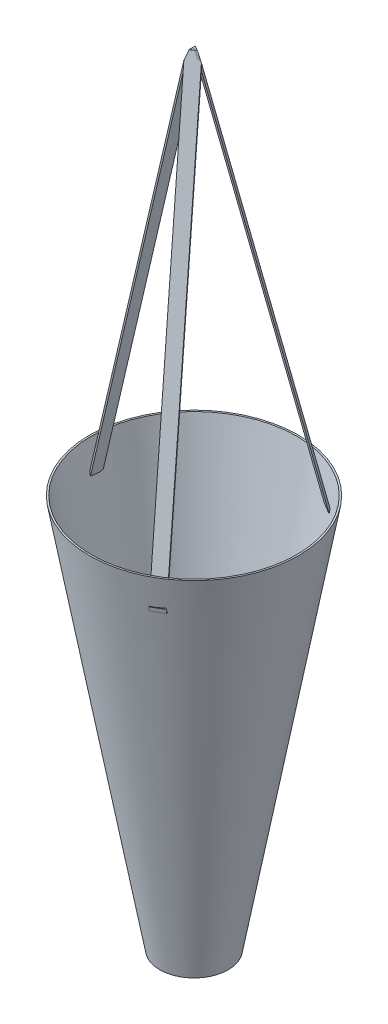
ISO-10303-21;
HEADER;
FILE_DESCRIPTION(('STEP AP214'),'2;1');
FILE_NAME('part.step','',(''),(''),'','','');
FILE_SCHEMA(('AUTOMOTIVE_DESIGN { 1 0 10303 214 1 1 1 1 }'));
ENDSEC;
DATA;
#1=APPLICATION_CONTEXT('core data for automotive mechanical design processes');
#2=APPLICATION_PROTOCOL_DEFINITION('international standard','automotive_design',2000,#1);
#3=PRODUCT_CONTEXT('',#1,'mechanical');
#4=PRODUCT('Part','Part','',(#3));
#5=PRODUCT_RELATED_PRODUCT_CATEGORY('part','',(#4));
#6=PRODUCT_DEFINITION_FORMATION('','',#4);
#7=PRODUCT_DEFINITION_CONTEXT('part definition',#1,'design');
#8=PRODUCT_DEFINITION('design','',#6,#7);
#9=PRODUCT_DEFINITION_SHAPE('','',#8);
#10=(LENGTH_UNIT() NAMED_UNIT(*) SI_UNIT(.MILLI.,.METRE.));
#11=(NAMED_UNIT(*) PLANE_ANGLE_UNIT() SI_UNIT($,.RADIAN.));
#12=(NAMED_UNIT(*) SI_UNIT($,.STERADIAN.) SOLID_ANGLE_UNIT());
#13=UNCERTAINTY_MEASURE_WITH_UNIT(LENGTH_MEASURE(1.E-05),#10,'distance_accuracy_value','');
#14=(GEOMETRIC_REPRESENTATION_CONTEXT(3) GLOBAL_UNCERTAINTY_ASSIGNED_CONTEXT((#13)) GLOBAL_UNIT_ASSIGNED_CONTEXT((#10,
#11,#12)) REPRESENTATION_CONTEXT('',''));
#15=CARTESIAN_POINT('',(0.,0.,0.));
#16=DIRECTION('',(0.,0.,1.));
#17=DIRECTION('',(1.,0.,0.));
#18=AXIS2_PLACEMENT_3D('',#15,#16,#17);
#19=CARTESIAN_POINT('',(81.7570441449587,-44.45,-122.557354335723));
#20=DIRECTION('',(0.486886500691648,0.227521739130435,-0.843312156717372));
#21=DIRECTION('',(0.113760869565216,-0.973773001383311,-0.197039606000174));
#22=AXIS2_PLACEMENT_3D('',#19,#20,#21);
#23=PLANE('',#22);
#24=DIRECTION('',(0.113760869565216,-0.973773001383311,-0.197039606000174));
#25=VECTOR('',#24,1.);
#26=CARTESIAN_POINT('',(65.2592602028651,-44.45,-132.082354335723));
#27=LINE('',#26,#25);
#28=CARTESIAN_POINT('',(-5.49926131403124,561.23047813184,-9.52499999999999));
#29=VERTEX_POINT('',#28);
#30=CARTESIAN_POINT('',(65.2592602028651,-44.45,-132.082354335723));
#31=VERTEX_POINT('',#30);
#32=EDGE_CURVE('E114',#29,#31,#27,.T.);
#33=ORIENTED_EDGE('',*,*,#32,.F.);
#34=DIRECTION('',(0.211678041190381,0.905963369850688,0.366637122188394));
#35=VECTOR('',#34,1.);
#36=CARTESIAN_POINT('',(-126.514738114892,43.2948975205752,-219.129954321261));
#37=LINE('',#36,#35);
#38=CARTESIAN_POINT('',(-2.54,573.895855878403,-4.39940905122488));
#39=VERTEX_POINT('',#38);
#40=EDGE_CURVE('E59',#29,#39,#37,.T.);
#41=ORIENTED_EDGE('',*,*,#40,.T.);
#42=DIRECTION('',(-0.866025403784443,0.,-0.499999999999992));
#43=VECTOR('',#42,1.);
#44=CARTESIAN_POINT('',(9.51889197104679,573.895855878403,2.56279547438745));
#45=LINE('',#44,#43);
#46=CARTESIAN_POINT('',(5.0800000000001,573.895855878403,0.));
#47=VERTEX_POINT('',#46);
#48=EDGE_CURVE('E133',#47,#39,#45,.T.);
#49=ORIENTED_EDGE('',*,*,#48,.F.);
#50=DIRECTION('',(-0.423356082380763,0.905963369850687,0.));
#51=VECTOR('',#50,1.);
#52=CARTESIAN_POINT('',(255.986380190965,36.9672532785679,-1.87350135405495E-12));
#53=LINE('',#52,#51);
#54=CARTESIAN_POINT('',(10.9985226280623,561.230478131841,0.));
#55=VERTEX_POINT('',#54);
#56=EDGE_CURVE('E118',#55,#47,#53,.T.);
#57=ORIENTED_EDGE('',*,*,#56,.F.);
#58=DIRECTION('',(0.113760869565216,-0.973773001383311,-0.197039606000174));
#59=VECTOR('',#58,1.);
#60=CARTESIAN_POINT('',(81.7570441449587,-44.45,-122.557354335723));
#61=LINE('',#60,#59);
#62=CARTESIAN_POINT('',(81.7570441449587,-44.45,-122.557354335723));
#63=VERTEX_POINT('',#62);
#64=EDGE_CURVE('E127',#55,#63,#61,.T.);
#65=ORIENTED_EDGE('',*,*,#64,.T.);
#66=DIRECTION('',(-0.866025403784443,0.,-0.499999999999992));
#67=VECTOR('',#66,1.);
#68=CARTESIAN_POINT('',(81.7570441449587,-44.45,-122.557354335723));
#69=LINE('',#68,#67);
#70=EDGE_CURVE('E130',#63,#31,#69,.T.);
#71=ORIENTED_EDGE('',*,*,#70,.T.);
#72=EDGE_LOOP('',(#33,#41,#49,#57,#65,#71));
#73=FACE_BOUND('',#72,.T.);
#74=ADVANCED_FACE('F45',(#73),#23,.T.);
#75=CARTESIAN_POINT('',(9.51889197104679,573.895855878403,2.56279547438745));
#76=DIRECTION('',(0.,1.,0.));
#77=DIRECTION('',(-0.866025403784443,0.,-0.499999999999992));
#78=AXIS2_PLACEMENT_3D('',#75,#76,#77);
#79=PLANE('',#78);
#80=ORIENTED_EDGE('',*,*,#48,.T.);
#81=DIRECTION('',(0.,0.,1.));
#82=VECTOR('',#81,1.);
#83=CARTESIAN_POINT('',(-2.54,573.895855878403,2.56279547438745));
#84=LINE('',#83,#82);
#85=CARTESIAN_POINT('',(-2.53999999999996,573.895855878403,-1.46646968374156));
#86=VERTEX_POINT('',#85);
#87=EDGE_CURVE('E109',#39,#86,#84,.T.);
#88=ORIENTED_EDGE('',*,*,#87,.T.);
#89=DIRECTION('',(-0.866025403784443,0.,-0.499999999999992));
#90=VECTOR('',#89,1.);
#91=CARTESIAN_POINT('',(8.24889197104681,573.895855878403,4.76249999999994));
#92=LINE('',#91,#90);
#93=CARTESIAN_POINT('',(2.54000000000008,573.895855878403,1.4664696837417));
#94=VERTEX_POINT('',#93);
#95=EDGE_CURVE('E108',#94,#86,#92,.T.);
#96=ORIENTED_EDGE('',*,*,#95,.F.);
#97=DIRECTION('',(-0.866025403784437,0.,0.500000000000002));
#98=VECTOR('',#97,1.);
#99=CARTESIAN_POINT('',(-6.97889197104672,573.895855878403,6.96220452561255));
#100=LINE('',#99,#98);
#101=EDGE_CURVE('E149',#47,#94,#100,.T.);
#102=ORIENTED_EDGE('',*,*,#101,.F.);
#103=EDGE_LOOP('',(#80,#88,#96,#102));
#104=FACE_BOUND('',#103,.T.);
#105=ADVANCED_FACE('F152',(#104),#79,.T.);
#106=CARTESIAN_POINT('',(8.24889197104681,573.895855878403,4.76249999999994));
#107=DIRECTION('',(-0.486886500691648,-0.227521739130435,0.843312156717372));
#108=DIRECTION('',(-0.113760869565216,0.973773001383311,0.197039606000174));
#109=AXIS2_PLACEMENT_3D('',#106,#107,#108);
#110=PLANE('',#109);
#111=ORIENTED_EDGE('',*,*,#95,.T.);
#112=DIRECTION('',(-0.211678041190381,-0.905963369850688,-0.366637122188394));
#113=VECTOR('',#112,1.);
#114=CARTESIAN_POINT('',(-1.57315143664399,578.03388256113,0.208161151215939));
#115=LINE('',#114,#113);
#116=CARTESIAN_POINT('',(-6.3459279806979,557.606819380276,-8.05853031625836));
#117=VERTEX_POINT('',#116);
#118=EDGE_CURVE('E96',#86,#117,#115,.T.);
#119=ORIENTED_EDGE('',*,*,#118,.T.);
#120=DIRECTION('',(-0.113760869565216,0.973773001383311,0.197039606000174));
#121=VECTOR('',#120,1.);
#122=CARTESIAN_POINT('',(-8.24889197104683,573.895855878403,-4.76249999999991));
#123=LINE('',#122,#121);
#124=CARTESIAN_POINT('',(64.7096474026701,-50.6163875143826,-131.130397041295));
#125=VERTEX_POINT('',#124);
#126=EDGE_CURVE('E105',#125,#117,#123,.T.);
#127=ORIENTED_EDGE('',*,*,#126,.F.);
#128=DIRECTION('',(-0.866025403784443,0.,-0.499999999999992));
#129=VECTOR('',#128,1.);
#130=CARTESIAN_POINT('',(81.2074313447637,-50.6163875143826,-121.605397041295));
#131=LINE('',#130,#129);
#132=CARTESIAN_POINT('',(81.2074313447637,-50.6163875143826,-121.605397041295));
#133=VERTEX_POINT('',#132);
#134=EDGE_CURVE('E129',#133,#125,#131,.T.);
#135=ORIENTED_EDGE('',*,*,#134,.F.);
#136=DIRECTION('',(-0.113760869565216,0.973773001383311,0.197039606000174));
#137=VECTOR('',#136,1.);
#138=CARTESIAN_POINT('',(8.24889197104681,573.895855878403,4.76249999999994));
#139=LINE('',#138,#137);
#140=CARTESIAN_POINT('',(10.1518559613957,557.606819380276,1.46646968374165));
#141=VERTEX_POINT('',#140);
#142=EDGE_CURVE('E124',#133,#141,#139,.T.);
#143=ORIENTED_EDGE('',*,*,#142,.T.);
#144=DIRECTION('',(0.423356082380763,-0.905963369850687,0.));
#145=VECTOR('',#144,1.);
#146=CARTESIAN_POINT('',(3.56320683446907,571.706238319121,1.4664696837417));
#147=LINE('',#146,#145);
#148=EDGE_CURVE('E67',#94,#141,#147,.T.);
#149=ORIENTED_EDGE('',*,*,#148,.F.);
#150=EDGE_LOOP('',(#111,#119,#127,#135,#143,#149));
#151=FACE_BOUND('',#150,.T.);
#152=ADVANCED_FACE('F104',(#151),#110,.T.);
#153=CARTESIAN_POINT('',(-8.24889197104682,0.,-4.76249999999992));
#154=DIRECTION('',(0.866025403784443,0.,0.499999999999992));
#155=DIRECTION('',(0.499999999999992,0.,-0.866025403784443));
#156=AXIS2_PLACEMENT_3D('',#153,#154,#155);
#157=PLANE('',#156);
#158=DIRECTION('',(-0.211678041190381,-0.905963369850685,0.366637122188405));
#159=VECTOR('',#158,1.);
#160=CARTESIAN_POINT('',(-113.620679423156,98.4803329002958,177.746789551406));
#161=LINE('',#160,#159);
#162=EDGE_CURVE('E12',#29,#117,#161,.T.);
#163=ORIENTED_EDGE('',*,*,#162,.F.);
#164=ORIENTED_EDGE('',*,*,#32,.T.);
#165=DIRECTION('',(-0.0877471696578557,-0.984480440063763,0.151982556067776));
#166=VECTOR('',#165,1.);
#167=CARTESIAN_POINT('',(64.7096474026701,-50.6163875143826,-131.130397041295));
#168=LINE('',#167,#166);
#169=EDGE_CURVE('E113',#31,#125,#168,.T.);
#170=ORIENTED_EDGE('',*,*,#169,.T.);
#171=ORIENTED_EDGE('',*,*,#126,.T.);
#172=EDGE_LOOP('',(#163,#164,#170,#171));
#173=FACE_BOUND('',#172,.T.);
#174=ADVANCED_FACE('F111',(#173),#157,.F.);
#175=CARTESIAN_POINT('',(81.2074313447637,-50.6163875143826,-121.605397041295));
#176=DIRECTION('',(0.492240220031874,-0.175494339315714,-0.852585070624107));
#177=DIRECTION('',(-0.0877471696578557,-0.984480440063763,0.151982556067776));
#178=AXIS2_PLACEMENT_3D('',#175,#176,#177);
#179=PLANE('',#178);
#180=ORIENTED_EDGE('',*,*,#134,.T.);
#181=ORIENTED_EDGE('',*,*,#169,.F.);
#182=ORIENTED_EDGE('',*,*,#70,.F.);
#183=DIRECTION('',(-0.0877471696578557,-0.984480440063763,0.151982556067776));
#184=VECTOR('',#183,1.);
#185=CARTESIAN_POINT('',(81.2074313447637,-50.6163875143826,-121.605397041295));
#186=LINE('',#185,#184);
#187=EDGE_CURVE('E116',#63,#133,#186,.T.);
#188=ORIENTED_EDGE('',*,*,#187,.T.);
#189=EDGE_LOOP('',(#180,#181,#182,#188));
#190=FACE_BOUND('',#189,.T.);
#191=ADVANCED_FACE('F47',(#190),#179,.T.);
#192=CARTESIAN_POINT('',(8.24889197104682,0.,4.76249999999992));
#193=DIRECTION('',(0.866025403784443,0.,0.499999999999992));
#194=DIRECTION('',(0.499999999999992,0.,-0.866025403784443));
#195=AXIS2_PLACEMENT_3D('',#192,#193,#194);
#196=PLANE('',#195);
#197=DIRECTION('',(0.211678041190375,0.90596336985069,-0.366637122188395));
#198=VECTOR('',#197,1.);
#199=CARTESIAN_POINT('',(-97.1228954810603,98.4803329002906,187.271789551402));
#200=LINE('',#199,#198);
#201=EDGE_CURVE('E53',#141,#55,#200,.T.);
#202=ORIENTED_EDGE('',*,*,#201,.F.);
#203=ORIENTED_EDGE('',*,*,#142,.F.);
#204=ORIENTED_EDGE('',*,*,#187,.F.);
#205=ORIENTED_EDGE('',*,*,#64,.F.);
#206=EDGE_LOOP('',(#202,#203,#204,#205));
#207=FACE_BOUND('',#206,.T.);
#208=ADVANCED_FACE('F147',(#207),#196,.T.);
#209=CARTESIAN_POINT('',(64.7788693887433,30.2711227386523,112.200293038171));
#210=DIRECTION('',(-0.486886500691658,-0.227521739130434,-0.843312156717366));
#211=DIRECTION('',(-0.866025403784437,0.,0.500000000000002));
#212=AXIS2_PLACEMENT_3D('',#209,#210,#211);
#213=PLANE('',#212);
#214=ORIENTED_EDGE('',*,*,#56,.T.);
#215=ORIENTED_EDGE('',*,*,#101,.T.);
#216=ORIENTED_EDGE('',*,*,#148,.T.);
#217=ORIENTED_EDGE('',*,*,#201,.T.);
#218=EDGE_LOOP('',(#214,#215,#216,#217));
#219=FACE_BOUND('',#218,.T.);
#220=ADVANCED_FACE('F138',(#219),#213,.F.);
#221=CARTESIAN_POINT('',(-129.557738777486,30.2711227386526,0.));
#222=DIRECTION('',(-0.973773001383311,0.227521739130435,0.));
#223=DIRECTION('',(-0.227521739130435,-0.973773001383311,0.));
#224=AXIS2_PLACEMENT_3D('',#221,#222,#223);
#225=PLANE('',#224);
#226=ORIENTED_EDGE('',*,*,#162,.T.);
#227=ORIENTED_EDGE('',*,*,#118,.F.);
#228=ORIENTED_EDGE('',*,*,#87,.F.);
#229=ORIENTED_EDGE('',*,*,#40,.F.);
#230=EDGE_LOOP('',(#226,#227,#228,#229));
#231=FACE_BOUND('',#230,.T.);
#232=ADVANCED_FACE('F95',(#231),#225,.T.);
#233=CLOSED_SHELL('',(#74,#105,#152,#174,#191,#208,#220,#232));
#234=MANIFOLD_SOLID_BREP('B2',#233);
#235=CARTESIAN_POINT('',(65.2592602028669,-44.45,132.082354335722));
#236=DIRECTION('',(0.48688650069166,0.227521739130435,0.843312156717365));
#237=DIRECTION('',(0.113760869565218,-0.973773001383311,0.197039606000172));
#238=AXIS2_PLACEMENT_3D('',#235,#236,#237);
#239=PLANE('',#238);
#240=DIRECTION('',(0.866025403784436,0.,-0.500000000000004));
#241=VECTOR('',#240,1.);
#242=CARTESIAN_POINT('',(-6.97889197104675,573.895855878403,6.9622045256125));
#243=LINE('',#242,#241);
#244=CARTESIAN_POINT('',(-2.53999999999997,573.895855878403,4.39940905122494));
#245=VERTEX_POINT('',#244);
#246=CARTESIAN_POINT('',(5.08000000000003,573.895855878403,0.));
#247=VERTEX_POINT('',#246);
#248=EDGE_CURVE('E293',#245,#247,#243,.T.);
#249=ORIENTED_EDGE('',*,*,#248,.F.);
#250=DIRECTION('',(-0.211678041190381,-0.905963369850687,0.3666371221884));
#251=VECTOR('',#250,1.);
#252=CARTESIAN_POINT('',(-127.993190095482,36.967253278568,221.690708268197));
#253=LINE('',#252,#251);
#254=CARTESIAN_POINT('',(-5.49926131403115,561.230478131841,9.52499999999999));
#255=VERTEX_POINT('',#254);
#256=EDGE_CURVE('E282',#245,#255,#253,.T.);
#257=ORIENTED_EDGE('',*,*,#256,.T.);
#258=DIRECTION('',(0.113760869565218,-0.973773001383311,0.197039606000172));
#259=VECTOR('',#258,1.);
#260=CARTESIAN_POINT('',(65.2592602028669,-44.45,132.082354335722));
#261=LINE('',#260,#259);
#262=CARTESIAN_POINT('',(65.2592602028669,-44.45,132.082354335722));
#263=VERTEX_POINT('',#262);
#264=EDGE_CURVE('E291',#255,#263,#261,.T.);
#265=ORIENTED_EDGE('',*,*,#264,.T.);
#266=DIRECTION('',(0.866025403784436,0.,-0.500000000000004));
#267=VECTOR('',#266,1.);
#268=CARTESIAN_POINT('',(65.2592602028669,-44.45,132.082354335722));
#269=LINE('',#268,#267);
#270=CARTESIAN_POINT('',(81.7570441449604,-44.45,122.557354335722));
#271=VERTEX_POINT('',#270);
#272=EDGE_CURVE('E309',#263,#271,#269,.T.);
#273=ORIENTED_EDGE('',*,*,#272,.T.);
#274=DIRECTION('',(0.113760869565218,-0.973773001383311,0.197039606000172));
#275=VECTOR('',#274,1.);
#276=CARTESIAN_POINT('',(81.7570441449604,-44.45,122.557354335722));
#277=LINE('',#276,#275);
#278=CARTESIAN_POINT('',(10.9985226280623,561.230478131841,-1.66533453693773E-13));
#279=VERTEX_POINT('',#278);
#280=EDGE_CURVE('E317',#279,#271,#277,.T.);
#281=ORIENTED_EDGE('',*,*,#280,.F.);
#282=DIRECTION('',(0.423356082380764,-0.905963369850686,0.));
#283=VECTOR('',#282,1.);
#284=CARTESIAN_POINT('',(253.029476229784,43.2948975205778,-1.9151347174784E-12));
#285=LINE('',#284,#283);
#286=EDGE_CURVE('E252',#247,#279,#285,.T.);
#287=ORIENTED_EDGE('',*,*,#286,.F.);
#288=EDGE_LOOP('',(#249,#257,#265,#273,#281,#287));
#289=FACE_BOUND('',#288,.T.);
#290=ADVANCED_FACE('F230',(#289),#239,.T.);
#291=CARTESIAN_POINT('',(-6.97889197104675,573.895855878403,6.9622045256125));
#292=DIRECTION('',(0.,1.,0.));
#293=DIRECTION('',(0.866025403784436,0.,-0.500000000000004));
#294=AXIS2_PLACEMENT_3D('',#291,#292,#293);
#295=PLANE('',#294);
#296=DIRECTION('',(0.866025403784436,0.,-0.500000000000004));
#297=VECTOR('',#296,1.);
#298=CARTESIAN_POINT('',(-8.24889197104677,573.895855878403,4.76250000000003));
#299=LINE('',#298,#297);
#300=CARTESIAN_POINT('',(-2.53999999999997,573.895855878403,1.46646968374161));
#301=VERTEX_POINT('',#300);
#302=CARTESIAN_POINT('',(2.54,573.895855878403,-1.46646968374168));
#303=VERTEX_POINT('',#302);
#304=EDGE_CURVE('E304',#301,#303,#299,.T.);
#305=ORIENTED_EDGE('',*,*,#304,.F.);
#306=DIRECTION('',(0.,0.,1.));
#307=VECTOR('',#306,1.);
#308=CARTESIAN_POINT('',(-2.53999999999997,573.895855878403,6.9622045256125));
#309=LINE('',#308,#307);
#310=EDGE_CURVE('E295',#301,#245,#309,.T.);
#311=ORIENTED_EDGE('',*,*,#310,.T.);
#312=ORIENTED_EDGE('',*,*,#248,.T.);
#313=DIRECTION('',(0.866025403784444,0.,0.499999999999991));
#314=VECTOR('',#313,1.);
#315=CARTESIAN_POINT('',(9.51889197104681,573.895855878403,2.56279547438742));
#316=LINE('',#315,#314);
#317=EDGE_CURVE('E294',#303,#247,#316,.T.);
#318=ORIENTED_EDGE('',*,*,#317,.F.);
#319=EDGE_LOOP('',(#305,#311,#312,#318));
#320=FACE_BOUND('',#319,.T.);
#321=ADVANCED_FACE('F338',(#320),#295,.T.);
#322=CARTESIAN_POINT('',(-8.24889197104677,573.895855878403,4.76250000000003));
#323=DIRECTION('',(-0.48688650069166,-0.227521739130435,-0.843312156717365));
#324=DIRECTION('',(-0.113760869565218,0.973773001383311,-0.197039606000172));
#325=AXIS2_PLACEMENT_3D('',#322,#323,#324);
#326=PLANE('',#325);
#327=DIRECTION('',(-0.113760869565218,0.973773001383311,-0.197039606000172));
#328=VECTOR('',#327,1.);
#329=CARTESIAN_POINT('',(-8.24889197104677,573.895855878403,4.76250000000003));
#330=LINE('',#329,#328);
#331=CARTESIAN_POINT('',(64.7096474026719,-50.6163875143826,131.130397041294));
#332=VERTEX_POINT('',#331);
#333=CARTESIAN_POINT('',(-6.34592798069784,557.606819380276,8.05853031625835));
#334=VERTEX_POINT('',#333);
#335=EDGE_CURVE('E302',#332,#334,#330,.T.);
#336=ORIENTED_EDGE('',*,*,#335,.T.);
#337=DIRECTION('',(0.211678041190381,0.905963369850687,-0.3666371221884));
#338=VECTOR('',#337,1.);
#339=CARTESIAN_POINT('',(-3.05160341723447,571.706238319121,2.35259279571763));
#340=LINE('',#339,#338);
#341=EDGE_CURVE('E245',#334,#301,#340,.T.);
#342=ORIENTED_EDGE('',*,*,#341,.T.);
#343=ORIENTED_EDGE('',*,*,#304,.T.);
#344=DIRECTION('',(-0.423356082380764,0.905963369850686,0.));
#345=VECTOR('',#344,1.);
#346=CARTESIAN_POINT('',(0.606302873287985,578.03388256113,-1.46646968374167));
#347=LINE('',#346,#345);
#348=CARTESIAN_POINT('',(10.1518559613956,557.606819380276,-1.46646968374178));
#349=VERTEX_POINT('',#348);
#350=EDGE_CURVE('E329',#349,#303,#347,.T.);
#351=ORIENTED_EDGE('',*,*,#350,.F.);
#352=DIRECTION('',(-0.113760869565218,0.973773001383311,-0.197039606000172));
#353=VECTOR('',#352,1.);
#354=CARTESIAN_POINT('',(8.24889197104675,573.895855878403,-4.76250000000005));
#355=LINE('',#354,#353);
#356=CARTESIAN_POINT('',(81.2074313447654,-50.6163875143826,121.605397041294));
#357=VERTEX_POINT('',#356);
#358=EDGE_CURVE('E319',#357,#349,#355,.T.);
#359=ORIENTED_EDGE('',*,*,#358,.F.);
#360=DIRECTION('',(0.866025403784436,0.,-0.500000000000004));
#361=VECTOR('',#360,1.);
#362=CARTESIAN_POINT('',(64.7096474026719,-50.6163875143826,131.130397041294));
#363=LINE('',#362,#361);
#364=EDGE_CURVE('E301',#332,#357,#363,.T.);
#365=ORIENTED_EDGE('',*,*,#364,.F.);
#366=EDGE_LOOP('',(#336,#342,#343,#351,#359,#365));
#367=FACE_BOUND('',#366,.T.);
#368=ADVANCED_FACE('F335',(#367),#326,.T.);
#369=CARTESIAN_POINT('',(-8.24889197104676,0.,4.76250000000004));
#370=DIRECTION('',(-0.866025403784436,0.,0.500000000000004));
#371=DIRECTION('',(0.500000000000004,0.,0.866025403784436));
#372=AXIS2_PLACEMENT_3D('',#369,#370,#371);
#373=PLANE('',#372);
#374=ORIENTED_EDGE('',*,*,#264,.F.);
#375=DIRECTION('',(-0.211678041190381,-0.905963369850689,-0.366637122188394));
#376=VECTOR('',#375,1.);
#377=CARTESIAN_POINT('',(-113.620679423157,98.480332900292,-177.746789551401));
#378=LINE('',#377,#376);
#379=EDGE_CURVE('E43',#255,#334,#378,.T.);
#380=ORIENTED_EDGE('',*,*,#379,.T.);
#381=ORIENTED_EDGE('',*,*,#335,.F.);
#382=DIRECTION('',(-0.0877471696578579,-0.984480440063763,-0.151982556067774));
#383=VECTOR('',#382,1.);
#384=CARTESIAN_POINT('',(64.7096474026719,-50.6163875143826,131.130397041294));
#385=LINE('',#384,#383);
#386=EDGE_CURVE('E300',#263,#332,#385,.T.);
#387=ORIENTED_EDGE('',*,*,#386,.F.);
#388=EDGE_LOOP('',(#374,#380,#381,#387));
#389=FACE_BOUND('',#388,.T.);
#390=ADVANCED_FACE('F298',(#389),#373,.T.);
#391=CARTESIAN_POINT('',(64.7096474026719,-50.6163875143826,131.130397041294));
#392=DIRECTION('',(0.492240220031886,-0.175494339315714,0.8525850706241));
#393=DIRECTION('',(-0.0877471696578578,-0.984480440063763,-0.151982556067774));
#394=AXIS2_PLACEMENT_3D('',#391,#392,#393);
#395=PLANE('',#394);
#396=ORIENTED_EDGE('',*,*,#364,.T.);
#397=DIRECTION('',(-0.0877471696578579,-0.984480440063763,-0.151982556067774));
#398=VECTOR('',#397,1.);
#399=CARTESIAN_POINT('',(81.2074313447654,-50.6163875143826,121.605397041294));
#400=LINE('',#399,#398);
#401=EDGE_CURVE('E324',#271,#357,#400,.T.);
#402=ORIENTED_EDGE('',*,*,#401,.F.);
#403=ORIENTED_EDGE('',*,*,#272,.F.);
#404=ORIENTED_EDGE('',*,*,#386,.T.);
#405=EDGE_LOOP('',(#396,#402,#403,#404));
#406=FACE_BOUND('',#405,.T.);
#407=ADVANCED_FACE('F232',(#406),#395,.T.);
#408=CARTESIAN_POINT('',(8.24889197104676,0.,-4.76250000000004));
#409=DIRECTION('',(-0.866025403784436,0.,0.500000000000004));
#410=DIRECTION('',(0.500000000000004,0.,0.866025403784436));
#411=AXIS2_PLACEMENT_3D('',#408,#409,#410);
#412=PLANE('',#411);
#413=ORIENTED_EDGE('',*,*,#358,.T.);
#414=DIRECTION('',(0.211678041190381,0.905963369850689,0.366637122188394));
#415=VECTOR('',#414,1.);
#416=CARTESIAN_POINT('',(-97.1228954810633,98.4803329002917,-187.271789551401));
#417=LINE('',#416,#415);
#418=EDGE_CURVE('E238',#349,#279,#417,.T.);
#419=ORIENTED_EDGE('',*,*,#418,.T.);
#420=ORIENTED_EDGE('',*,*,#280,.T.);
#421=ORIENTED_EDGE('',*,*,#401,.T.);
#422=EDGE_LOOP('',(#413,#419,#420,#421));
#423=FACE_BOUND('',#422,.T.);
#424=ADVANCED_FACE('F315',(#423),#412,.F.);
#425=CARTESIAN_POINT('',(64.7788693887421,30.2711227386526,-112.200293038172));
#426=DIRECTION('',(-0.486886500691647,-0.227521739130435,0.843312156717372));
#427=DIRECTION('',(0.866025403784444,0.,0.499999999999991));
#428=AXIS2_PLACEMENT_3D('',#425,#426,#427);
#429=PLANE('',#428);
#430=ORIENTED_EDGE('',*,*,#286,.T.);
#431=ORIENTED_EDGE('',*,*,#418,.F.);
#432=ORIENTED_EDGE('',*,*,#350,.T.);
#433=ORIENTED_EDGE('',*,*,#317,.T.);
#434=EDGE_LOOP('',(#430,#431,#432,#433));
#435=FACE_BOUND('',#434,.T.);
#436=ADVANCED_FACE('F339',(#435),#429,.F.);
#437=CARTESIAN_POINT('',(-129.557738777486,30.2711227386526,0.));
#438=DIRECTION('',(-0.973773001383311,0.227521739130435,0.));
#439=DIRECTION('',(-0.227521739130435,-0.973773001383311,0.));
#440=AXIS2_PLACEMENT_3D('',#437,#438,#439);
#441=PLANE('',#440);
#442=ORIENTED_EDGE('',*,*,#310,.F.);
#443=ORIENTED_EDGE('',*,*,#341,.F.);
#444=ORIENTED_EDGE('',*,*,#379,.F.);
#445=ORIENTED_EDGE('',*,*,#256,.F.);
#446=EDGE_LOOP('',(#442,#443,#444,#445));
#447=FACE_BOUND('',#446,.T.);
#448=ADVANCED_FACE('F281',(#447),#441,.T.);
#449=CLOSED_SHELL('',(#290,#321,#368,#390,#407,#424,#436,#448));
#450=MANIFOLD_SOLID_BREP('B6',#449);
#451=CARTESIAN_POINT('',(-147.016304347826,-44.45,-9.525));
#452=DIRECTION('',(-0.973773001383311,0.227521739130435,0.));
#453=DIRECTION('',(-0.227521739130435,-0.973773001383311,0.));
#454=AXIS2_PLACEMENT_3D('',#451,#452,#453);
#455=PLANE('',#454);
#456=DIRECTION('',(-0.227521739130435,-0.973773001383311,0.));
#457=VECTOR('',#456,1.);
#458=CARTESIAN_POINT('',(-147.016304347826,-44.45,-9.525));
#459=LINE('',#458,#457);
#460=CARTESIAN_POINT('',(-5.48649966157581,561.285096880192,-9.525));
#461=VERTEX_POINT('',#460);
#462=CARTESIAN_POINT('',(-147.016304347826,-44.45,-9.525));
#463=VERTEX_POINT('',#462);
#464=EDGE_CURVE('E492',#461,#463,#459,.T.);
#465=ORIENTED_EDGE('',*,*,#464,.T.);
#466=DIRECTION('',(0.,0.,1.));
#467=VECTOR('',#466,1.);
#468=CARTESIAN_POINT('',(-147.016304347826,-44.45,-9.525));
#469=LINE('',#468,#467);
#470=CARTESIAN_POINT('',(-147.016304347826,-44.45,9.525));
#471=VERTEX_POINT('',#470);
#472=EDGE_CURVE('E490',#463,#471,#469,.T.);
#473=ORIENTED_EDGE('',*,*,#472,.T.);
#474=DIRECTION('',(-0.227521739130435,-0.973773001383311,0.));
#475=VECTOR('',#474,1.);
#476=CARTESIAN_POINT('',(-147.016304347826,-44.45,9.525));
#477=LINE('',#476,#475);
#478=CARTESIAN_POINT('',(-5.49926131403111,561.230478131841,9.525));
#479=VERTEX_POINT('',#478);
#480=EDGE_CURVE('E524',#479,#471,#477,.T.);
#481=ORIENTED_EDGE('',*,*,#480,.F.);
#482=DIRECTION('',(-0.211678041190381,-0.905963369850687,0.366637122188398));
#483=VECTOR('',#482,1.);
#484=CARTESIAN_POINT('',(-126.514738114892,43.2948975205768,219.129954321263));
#485=LINE('',#484,#483);
#486=CARTESIAN_POINT('',(-2.54,573.895855878403,4.39940905122505));
#487=VERTEX_POINT('',#486);
#488=EDGE_CURVE('E427',#487,#479,#485,.T.);
#489=ORIENTED_EDGE('',*,*,#488,.F.);
#490=DIRECTION('',(0.,0.,1.));
#491=VECTOR('',#490,1.);
#492=CARTESIAN_POINT('',(-2.53999999999999,573.895855878403,-9.525));
#493=LINE('',#492,#491);
#494=CARTESIAN_POINT('',(-2.54,573.895855878403,-4.3994090512249));
#495=VERTEX_POINT('',#494);
#496=EDGE_CURVE('E484',#495,#487,#493,.T.);
#497=ORIENTED_EDGE('',*,*,#496,.F.);
#498=DIRECTION('',(0.211678041190382,0.905963369850689,0.366637122188394));
#499=VECTOR('',#498,1.);
#500=CARTESIAN_POINT('',(-127.993190095482,36.9672532785655,-221.690708268195));
#501=LINE('',#500,#499);
#502=CARTESIAN_POINT('',(-5.49288048780342,561.257787506019,-9.51394808477861));
#503=VERTEX_POINT('',#502);
#504=EDGE_CURVE('E514',#503,#495,#501,.T.);
#505=ORIENTED_EDGE('',*,*,#504,.F.);
#506=DIRECTION('',(0.211678041190381,0.905963369850685,-0.366637122188404));
#507=VECTOR('',#506,1.);
#508=CARTESIAN_POINT('',(-127.991474638689,36.9745952825289,202.659840840318));
#509=LINE('',#508,#507);
#510=EDGE_CURVE('E507',#503,#461,#509,.T.);
#511=ORIENTED_EDGE('',*,*,#510,.T.);
#512=EDGE_LOOP('',(#465,#473,#481,#489,#497,#505,#511));
#513=FACE_BOUND('',#512,.T.);
#514=ADVANCED_FACE('F412',(#513),#455,.T.);
#515=CARTESIAN_POINT('',(0.,0.,-9.525));
#516=DIRECTION('',(0.,0.,-1.));
#517=DIRECTION('',(-1.,0.,0.));
#518=AXIS2_PLACEMENT_3D('',#515,#516,#517);
#519=PLANE('',#518);
#520=ORIENTED_EDGE('',*,*,#464,.F.);
#521=DIRECTION('',(0.,-1.,0.));
#522=VECTOR('',#521,1.);
#523=CARTESIAN_POINT('',(-5.48649966157613,0.,-9.525));
#524=LINE('',#523,#522);
#525=CARTESIAN_POINT('',(-5.48649966157582,561.203168757665,-9.52499999999999));
#526=VERTEX_POINT('',#525);
#527=EDGE_CURVE('E420',#461,#526,#524,.T.);
#528=ORIENTED_EDGE('',*,*,#527,.T.);
#529=DIRECTION('',(-0.423356082380769,0.905963369850684,0.));
#530=VECTOR('',#529,1.);
#531=CARTESIAN_POINT('',(210.743574904222,98.4803329002961,-9.525));
#532=LINE('',#531,#530);
#533=CARTESIAN_POINT('',(-3.8059279806979,557.606819380276,-9.525));
#534=VERTEX_POINT('',#533);
#535=EDGE_CURVE('E496',#534,#526,#532,.T.);
#536=ORIENTED_EDGE('',*,*,#535,.F.);
#537=DIRECTION('',(0.227521739130435,0.973773001383311,0.));
#538=VECTOR('',#537,1.);
#539=CARTESIAN_POINT('',(0.,573.895855878403,-9.525));
#540=LINE('',#539,#538);
#541=CARTESIAN_POINT('',(-145.917078747436,-50.6163875143826,-9.525));
#542=VERTEX_POINT('',#541);
#543=EDGE_CURVE('E529',#542,#534,#540,.T.);
#544=ORIENTED_EDGE('',*,*,#543,.F.);
#545=DIRECTION('',(0.175494339315714,-0.984480440063763,0.));
#546=VECTOR('',#545,1.);
#547=CARTESIAN_POINT('',(-145.917078747436,-50.6163875143826,-9.525));
#548=LINE('',#547,#546);
#549=EDGE_CURVE('E526',#463,#542,#548,.T.);
#550=ORIENTED_EDGE('',*,*,#549,.F.);
#551=EDGE_LOOP('',(#520,#528,#536,#544,#550));
#552=FACE_BOUND('',#551,.T.);
#553=ADVANCED_FACE('F500',(#552),#519,.T.);
#554=CARTESIAN_POINT('',(-145.917078747436,-50.6163875143826,-9.525));
#555=DIRECTION('',(-0.984480440063763,-0.175494339315714,0.));
#556=DIRECTION('',(0.175494339315714,-0.984480440063763,0.));
#557=AXIS2_PLACEMENT_3D('',#554,#555,#556);
#558=PLANE('',#557);
#559=DIRECTION('',(0.,0.,1.));
#560=VECTOR('',#559,1.);
#561=CARTESIAN_POINT('',(-145.917078747436,-50.6163875143826,-9.525));
#562=LINE('',#561,#560);
#563=CARTESIAN_POINT('',(-145.917078747436,-50.6163875143826,9.525));
#564=VERTEX_POINT('',#563);
#565=EDGE_CURVE('E488',#542,#564,#562,.T.);
#566=ORIENTED_EDGE('',*,*,#565,.T.);
#567=DIRECTION('',(0.175494339315714,-0.984480440063763,0.));
#568=VECTOR('',#567,1.);
#569=CARTESIAN_POINT('',(-145.917078747436,-50.6163875143826,9.525));
#570=LINE('',#569,#568);
#571=EDGE_CURVE('E515',#471,#564,#570,.T.);
#572=ORIENTED_EDGE('',*,*,#571,.F.);
#573=ORIENTED_EDGE('',*,*,#472,.F.);
#574=ORIENTED_EDGE('',*,*,#549,.T.);
#575=EDGE_LOOP('',(#566,#572,#573,#574));
#576=FACE_BOUND('',#575,.T.);
#577=ADVANCED_FACE('F414',(#576),#558,.T.);
#578=CARTESIAN_POINT('',(-2.53999999999999,573.895855878403,-9.525));
#579=DIRECTION('',(0.,1.,0.));
#580=DIRECTION('',(0.,0.,1.));
#581=AXIS2_PLACEMENT_3D('',#578,#579,#580);
#582=PLANE('',#581);
#583=DIRECTION('',(-0.866025403784437,0.,0.500000000000002));
#584=VECTOR('',#583,1.);
#585=CARTESIAN_POINT('',(-6.97889197104672,573.895855878403,6.96220452561255));
#586=LINE('',#585,#584);
#587=CARTESIAN_POINT('',(0.,573.895855878403,2.93293936748337));
#588=VERTEX_POINT('',#587);
#589=EDGE_CURVE('E471',#588,#487,#586,.T.);
#590=ORIENTED_EDGE('',*,*,#589,.F.);
#591=DIRECTION('',(0.,0.,1.));
#592=VECTOR('',#591,1.);
#593=CARTESIAN_POINT('',(0.,573.895855878403,-9.525));
#594=LINE('',#593,#592);
#595=CARTESIAN_POINT('',(0.,573.895855878403,-2.9329393674833));
#596=VERTEX_POINT('',#595);
#597=EDGE_CURVE('E482',#596,#588,#594,.T.);
#598=ORIENTED_EDGE('',*,*,#597,.F.);
#599=DIRECTION('',(0.866025403784444,0.,0.499999999999991));
#600=VECTOR('',#599,1.);
#601=CARTESIAN_POINT('',(9.51889197104681,573.895855878403,2.56279547438742));
#602=LINE('',#601,#600);
#603=EDGE_CURVE('E606',#495,#596,#602,.T.);
#604=ORIENTED_EDGE('',*,*,#603,.F.);
#605=ORIENTED_EDGE('',*,*,#496,.T.);
#606=EDGE_LOOP('',(#590,#598,#604,#605));
#607=FACE_BOUND('',#606,.T.);
#608=ADVANCED_FACE('F480',(#607),#582,.T.);
#609=CARTESIAN_POINT('',(0.,573.895855878403,-9.525));
#610=DIRECTION('',(0.973773001383311,-0.227521739130435,0.));
#611=DIRECTION('',(0.227521739130435,0.973773001383311,0.));
#612=AXIS2_PLACEMENT_3D('',#609,#610,#611);
#613=PLANE('',#612);
#614=DIRECTION('',(0.211678041190381,0.905963369850687,-0.366637122188398));
#615=VECTOR('',#614,1.);
#616=CARTESIAN_POINT('',(0.966848563356022,578.03388256113,1.25830853252585));
#617=LINE('',#616,#615);
#618=CARTESIAN_POINT('',(-3.80592798069777,557.606819380276,9.525));
#619=VERTEX_POINT('',#618);
#620=EDGE_CURVE('E468',#619,#588,#617,.T.);
#621=ORIENTED_EDGE('',*,*,#620,.F.);
#622=DIRECTION('',(0.227521739130435,0.973773001383311,0.));
#623=VECTOR('',#622,1.);
#624=CARTESIAN_POINT('',(0.,573.895855878403,9.525));
#625=LINE('',#624,#623);
#626=EDGE_CURVE('E518',#564,#619,#625,.T.);
#627=ORIENTED_EDGE('',*,*,#626,.F.);
#628=ORIENTED_EDGE('',*,*,#565,.F.);
#629=ORIENTED_EDGE('',*,*,#543,.T.);
#630=DIRECTION('',(-0.211678041190382,-0.905963369850689,-0.366637122188394));
#631=VECTOR('',#630,1.);
#632=CARTESIAN_POINT('',(-0.511603417234461,571.706238319121,-3.81906247945926));
#633=LINE('',#632,#631);
#634=EDGE_CURVE('E434',#596,#534,#633,.T.);
#635=ORIENTED_EDGE('',*,*,#634,.F.);
#636=ORIENTED_EDGE('',*,*,#597,.T.);
#637=EDGE_LOOP('',(#621,#627,#628,#629,#635,#636));
#638=FACE_BOUND('',#637,.T.);
#639=ADVANCED_FACE('F486',(#638),#613,.T.);
#640=CARTESIAN_POINT('',(0.,0.,9.525));
#641=DIRECTION('',(0.,0.,-1.));
#642=DIRECTION('',(-1.,0.,0.));
#643=AXIS2_PLACEMENT_3D('',#640,#641,#642);
#644=PLANE('',#643);
#645=ORIENTED_EDGE('',*,*,#626,.T.);
#646=DIRECTION('',(-0.423356082380759,0.905963369850689,0.));
#647=VECTOR('',#646,1.);
#648=CARTESIAN_POINT('',(210.743574904218,98.4803329002917,9.525));
#649=LINE('',#648,#647);
#650=EDGE_CURVE('E228',#619,#479,#649,.T.);
#651=ORIENTED_EDGE('',*,*,#650,.T.);
#652=ORIENTED_EDGE('',*,*,#480,.T.);
#653=ORIENTED_EDGE('',*,*,#571,.T.);
#654=EDGE_LOOP('',(#645,#651,#652,#653));
#655=FACE_BOUND('',#654,.T.);
#656=ADVANCED_FACE('F535',(#655),#644,.F.);
#657=CARTESIAN_POINT('',(-2.33172681261731,576.06300044362,-14.989226860735));
#658=DIRECTION('',(0.866025403784443,0.,0.499999999999992));
#659=DIRECTION('',(0.499999999999992,0.,-0.866025403784443));
#660=AXIS2_PLACEMENT_3D('',#657,#658,#659);
#661=PLANE('',#660);
#662=DIRECTION('',(-0.113760869565215,0.973773001383311,0.197039606000174));
#663=VECTOR('',#662,1.);
#664=CARTESIAN_POINT('',(-6.96932073170525,573.895855878403,-6.95667856800206));
#665=LINE('',#664,#663);
#666=EDGE_CURVE('E509',#526,#503,#665,.T.);
#667=ORIENTED_EDGE('',*,*,#666,.F.);
#668=ORIENTED_EDGE('',*,*,#527,.F.);
#669=ORIENTED_EDGE('',*,*,#510,.F.);
#670=EDGE_LOOP('',(#667,#668,#669));
#671=FACE_BOUND('',#670,.T.);
#672=ADVANCED_FACE('F506',(#671),#661,.T.);
#673=CARTESIAN_POINT('',(64.7788693887421,30.2711227386526,-112.200293038172));
#674=DIRECTION('',(-0.486886500691647,-0.227521739130435,0.843312156717372));
#675=DIRECTION('',(0.866025403784444,0.,0.499999999999991));
#676=AXIS2_PLACEMENT_3D('',#673,#674,#675);
#677=PLANE('',#676);
#678=ORIENTED_EDGE('',*,*,#504,.T.);
#679=ORIENTED_EDGE('',*,*,#603,.T.);
#680=ORIENTED_EDGE('',*,*,#634,.T.);
#681=ORIENTED_EDGE('',*,*,#535,.T.);
#682=ORIENTED_EDGE('',*,*,#666,.T.);
#683=EDGE_LOOP('',(#678,#679,#680,#681,#682));
#684=FACE_BOUND('',#683,.T.);
#685=ADVANCED_FACE('F542',(#684),#677,.F.);
#686=CARTESIAN_POINT('',(64.7788693887433,30.2711227386523,112.200293038171));
#687=DIRECTION('',(-0.486886500691658,-0.227521739130434,-0.843312156717366));
#688=DIRECTION('',(-0.866025403784437,0.,0.500000000000002));
#689=AXIS2_PLACEMENT_3D('',#686,#687,#688);
#690=PLANE('',#689);
#691=ORIENTED_EDGE('',*,*,#488,.T.);
#692=ORIENTED_EDGE('',*,*,#650,.F.);
#693=ORIENTED_EDGE('',*,*,#620,.T.);
#694=ORIENTED_EDGE('',*,*,#589,.T.);
#695=EDGE_LOOP('',(#691,#692,#693,#694));
#696=FACE_BOUND('',#695,.T.);
#697=ADVANCED_FACE('F470',(#696),#690,.F.);
#698=CLOSED_SHELL('',(#514,#553,#577,#608,#639,#656,#672,#685,#697));
#699=MANIFOLD_SOLID_BREP('B37',#698);
#700=CARTESIAN_POINT('',(0.,-584.2,0.));
#701=DIRECTION('',(0.,1.,0.));
#702=DIRECTION('',(0.,0.,1.));
#703=AXIS2_PLACEMENT_3D('',#700,#701,#702);
#704=CONICAL_SURFACE('',#703,48.2599999999999,0.176407877900043);
#705=CARTESIAN_POINT('',(0.,0.,0.));
#706=DIRECTION('',(0.,1.,0.));
#707=DIRECTION('',(0.,0.,1.));
#708=AXIS2_PLACEMENT_3D('',#705,#706,#707);
#709=CIRCLE('',#708,152.4);
#710=CARTESIAN_POINT('',(0.,-1.11022302462516E-13,152.4));
#711=VERTEX_POINT('',#710);
#712=EDGE_CURVE('E411',#711,#711,#709,.T.);
#713=CARTESIAN_POINT('',(0.,-584.2,0.));
#714=DIRECTION('',(0.,1.,0.));
#715=DIRECTION('',(0.,0.,1.));
#716=AXIS2_PLACEMENT_3D('',#713,#714,#715);
#717=CIRCLE('',#716,48.2599999999999);
#718=CARTESIAN_POINT('',(0.,-584.2,48.2599999999999));
#719=VERTEX_POINT('',#718);
#720=EDGE_CURVE('E627',#719,#719,#717,.T.);
#721=CARTESIAN_POINT('',(0.,-1.11022302462516E-13,152.4));
#722=CARTESIAN_POINT('',(0.,-6.08541666666677,151.315208333333));
#723=CARTESIAN_POINT('',(0.,-12.1708333333334,150.230416666667));
#724=CARTESIAN_POINT('',(0.,-24.3416666666667,148.060833333333));
#725=CARTESIAN_POINT('',(0.,-30.4270833333334,146.976041666667));
#726=CARTESIAN_POINT('',(0.,-42.5979166666668,144.806458333333));
#727=CARTESIAN_POINT('',(0.,-48.6833333333334,143.721666666667));
#728=CARTESIAN_POINT('',(0.,-60.8541666666668,141.552083333333));
#729=CARTESIAN_POINT('',(0.,-66.9395833333335,140.467291666667));
#730=CARTESIAN_POINT('',(0.,-79.1104166666668,138.297708333333));
#731=CARTESIAN_POINT('',(0.,-85.1958333333334,137.212916666667));
#732=CARTESIAN_POINT('',(0.,-97.3666666666668,135.043333333333));
#733=CARTESIAN_POINT('',(0.,-103.452083333333,133.958541666667));
#734=CARTESIAN_POINT('',(0.,-115.622916666667,131.788958333333));
#735=CARTESIAN_POINT('',(0.,-121.708333333333,130.704166666667));
#736=CARTESIAN_POINT('',(0.,-133.879166666667,128.534583333333));
#737=CARTESIAN_POINT('',(0.,-139.964583333333,127.449791666667));
#738=CARTESIAN_POINT('',(0.,-152.135416666667,125.280208333333));
#739=CARTESIAN_POINT('',(0.,-158.220833333333,124.195416666667));
#740=CARTESIAN_POINT('',(0.,-170.391666666667,122.025833333333));
#741=CARTESIAN_POINT('',(0.,-176.477083333333,120.941041666667));
#742=CARTESIAN_POINT('',(0.,-188.647916666667,118.771458333333));
#743=CARTESIAN_POINT('',(0.,-194.733333333333,117.686666666667));
#744=CARTESIAN_POINT('',(0.,-206.904166666667,115.517083333333));
#745=CARTESIAN_POINT('',(0.,-212.989583333333,114.432291666667));
#746=CARTESIAN_POINT('',(0.,-225.160416666667,112.262708333333));
#747=CARTESIAN_POINT('',(0.,-231.245833333333,111.177916666667));
#748=CARTESIAN_POINT('',(0.,-243.416666666667,109.008333333333));
#749=CARTESIAN_POINT('',(0.,-249.502083333333,107.923541666667));
#750=CARTESIAN_POINT('',(0.,-261.672916666667,105.753958333333));
#751=CARTESIAN_POINT('',(0.,-267.758333333333,104.669166666667));
#752=CARTESIAN_POINT('',(0.,-279.929166666667,102.499583333333));
#753=CARTESIAN_POINT('',(0.,-286.014583333333,101.414791666667));
#754=CARTESIAN_POINT('',(0.,-298.185416666667,99.2452083333333));
#755=CARTESIAN_POINT('',(0.,-304.270833333333,98.1604166666666));
#756=CARTESIAN_POINT('',(0.,-316.441666666667,95.9908333333333));
#757=CARTESIAN_POINT('',(0.,-322.527083333333,94.9060416666666));
#758=CARTESIAN_POINT('',(0.,-334.697916666667,92.7364583333333));
#759=CARTESIAN_POINT('',(0.,-340.783333333333,91.6516666666666));
#760=CARTESIAN_POINT('',(0.,-352.954166666667,89.4820833333333));
#761=CARTESIAN_POINT('',(0.,-359.039583333333,88.3972916666666));
#762=CARTESIAN_POINT('',(0.,-371.210416666667,86.2277083333333));
#763=CARTESIAN_POINT('',(0.,-377.295833333333,85.1429166666666));
#764=CARTESIAN_POINT('',(0.,-389.466666666667,82.9733333333333));
#765=CARTESIAN_POINT('',(0.,-395.552083333333,81.8885416666666));
#766=CARTESIAN_POINT('',(0.,-407.722916666667,79.7189583333333));
#767=CARTESIAN_POINT('',(0.,-413.808333333333,78.6341666666666));
#768=CARTESIAN_POINT('',(0.,-425.979166666667,76.4645833333333));
#769=CARTESIAN_POINT('',(0.,-432.064583333333,75.3797916666666));
#770=CARTESIAN_POINT('',(0.,-444.235416666667,73.2102083333333));
#771=CARTESIAN_POINT('',(0.,-450.320833333333,72.1254166666666));
#772=CARTESIAN_POINT('',(0.,-462.491666666667,69.9558333333333));
#773=CARTESIAN_POINT('',(0.,-468.577083333333,68.8710416666666));
#774=CARTESIAN_POINT('',(0.,-480.747916666667,66.7014583333332));
#775=CARTESIAN_POINT('',(0.,-486.833333333333,65.6166666666666));
#776=CARTESIAN_POINT('',(0.,-499.004166666667,63.4470833333333));
#777=CARTESIAN_POINT('',(0.,-505.089583333333,62.3622916666666));
#778=CARTESIAN_POINT('',(0.,-517.260416666667,60.1927083333333));
#779=CARTESIAN_POINT('',(0.,-523.345833333333,59.1079166666666));
#780=CARTESIAN_POINT('',(0.,-535.516666666667,56.9383333333332));
#781=CARTESIAN_POINT('',(0.,-541.602083333333,55.8535416666666));
#782=CARTESIAN_POINT('',(0.,-553.772916666667,53.6839583333332));
#783=CARTESIAN_POINT('',(0.,-559.858333333333,52.5991666666666));
#784=CARTESIAN_POINT('',(0.,-572.029166666667,50.4295833333332));
#785=CARTESIAN_POINT('',(0.,-578.114583333333,49.3447916666666));
#786=CARTESIAN_POINT('',(0.,-584.2,48.2599999999999));
#787=B_SPLINE_CURVE_WITH_KNOTS('',3,(#721,#722,#723,#724,#725,#726,#727,#728,#729,#730,#731,
#732,#733,#734,#735,#736,#737,#738,#739,#740,#741,#742,#743,#744,#745,#746,#747,#748,#749,#750,
#751,#752,#753,#754,#755,#756,#757,#758,#759,#760,#761,#762,#763,#764,#765,#766,#767,#768,#769,
#770,#771,#772,#773,#774,#775,#776,#777,#778,#779,#780,#781,#782,#783,#784,#785,#786),
.UNSPECIFIED.,.F.,.F.,(4,2,2,2,2,2,2,2,2,2,2,2,2,2,2,2,2,2,2,2,2,2,2,2,2,2,2,2,2,2,2,2,4),(0.,
18.5440454244246,37.0880908488493,55.632136273274,74.1761816976986,92.7202271221233,
111.264272546548,129.808317970973,148.352363395397,166.896408819822,185.440454244246,
203.984499668671,222.528545093096,241.07259051752,259.616635941945,278.16068136637,
296.704726790794,315.248772215219,333.792817639644,352.336863064068,370.880908488493,
389.424953912918,407.968999337342,426.513044761767,445.057090186191,463.601135610616,
482.145181035041,500.689226459465,519.23327188389,537.777317308315,556.32136273274,
574.865408157164,593.409453581589),.UNSPECIFIED.);
#788=EDGE_CURVE('BSEAM613',#711,#719,#787,.T.);
#789=ORIENTED_EDGE('',*,*,#712,.T.);
#790=ORIENTED_EDGE('',*,*,#720,.F.);
#791=ORIENTED_EDGE('',*,*,#788,.T.);
#792=ORIENTED_EDGE('',*,*,#788,.F.);
#793=EDGE_LOOP('',(#789,#791,#790,#792));
#794=FACE_BOUND('',#793,.T.);
#795=ADVANCED_FACE('F613',(#794),#704,.F.);
#796=CARTESIAN_POINT('',(-152.4,0.,0.));
#797=DIRECTION('',(0.,1.,0.));
#798=DIRECTION('',(0.,0.,1.));
#799=AXIS2_PLACEMENT_3D('',#796,#797,#798);
#800=PLANE('',#799);
#801=CARTESIAN_POINT('',(0.,0.,0.));
#802=DIRECTION('',(0.,1.,0.));
#803=DIRECTION('',(0.,0.,1.));
#804=AXIS2_PLACEMENT_3D('',#801,#802,#803);
#805=CIRCLE('',#804,154.94);
#806=CARTESIAN_POINT('',(0.,0.,154.94));
#807=VERTEX_POINT('',#806);
#808=EDGE_CURVE('E619',#807,#807,#805,.T.);
#809=ORIENTED_EDGE('',*,*,#808,.T.);
#810=EDGE_LOOP('',(#809));
#811=FACE_BOUND('',#810,.T.);
#812=ORIENTED_EDGE('',*,*,#712,.F.);
#813=EDGE_LOOP('',(#812));
#814=FACE_BOUND('',#813,.T.);
#815=ADVANCED_FACE('F637',(#811,#814),#800,.T.);
#816=CARTESIAN_POINT('',(0.,0.,0.));
#817=DIRECTION('',(0.,1.,0.));
#818=DIRECTION('',(0.,0.,1.));
#819=AXIS2_PLACEMENT_3D('',#816,#817,#818);
#820=CONICAL_SURFACE('',#819,154.94,0.176407877900043);
#821=CARTESIAN_POINT('',(0.,-584.2,0.));
#822=DIRECTION('',(0.,1.,0.));
#823=DIRECTION('',(0.,0.,1.));
#824=AXIS2_PLACEMENT_3D('',#821,#822,#823);
#825=CIRCLE('',#824,50.7999999999999);
#826=CARTESIAN_POINT('',(0.,-584.2,50.7999999999999));
#827=VERTEX_POINT('',#826);
#828=EDGE_CURVE('E623',#827,#827,#825,.T.);
#829=CARTESIAN_POINT('',(0.,-584.2,50.7999999999999));
#830=CARTESIAN_POINT('',(0.,-578.114583333333,51.8847916666666));
#831=CARTESIAN_POINT('',(0.,-572.029166666667,52.9695833333332));
#832=CARTESIAN_POINT('',(0.,-559.858333333333,55.1391666666666));
#833=CARTESIAN_POINT('',(0.,-553.772916666667,56.2239583333332));
#834=CARTESIAN_POINT('',(0.,-541.602083333333,58.3935416666666));
#835=CARTESIAN_POINT('',(0.,-535.516666666667,59.4783333333332));
#836=CARTESIAN_POINT('',(0.,-523.345833333333,61.6479166666666));
#837=CARTESIAN_POINT('',(0.,-517.260416666667,62.7327083333332));
#838=CARTESIAN_POINT('',(0.,-505.089583333333,64.9022916666666));
#839=CARTESIAN_POINT('',(0.,-499.004166666667,65.9870833333332));
#840=CARTESIAN_POINT('',(0.,-486.833333333333,68.1566666666666));
#841=CARTESIAN_POINT('',(0.,-480.747916666667,69.2414583333333));
#842=CARTESIAN_POINT('',(0.,-468.577083333333,71.4110416666666));
#843=CARTESIAN_POINT('',(0.,-462.491666666667,72.4958333333333));
#844=CARTESIAN_POINT('',(0.,-450.320833333333,74.6654166666666));
#845=CARTESIAN_POINT('',(0.,-444.235416666667,75.7502083333333));
#846=CARTESIAN_POINT('',(0.,-432.064583333333,77.9197916666666));
#847=CARTESIAN_POINT('',(0.,-425.979166666667,79.0045833333333));
#848=CARTESIAN_POINT('',(0.,-413.808333333333,81.1741666666666));
#849=CARTESIAN_POINT('',(0.,-407.722916666667,82.2589583333333));
#850=CARTESIAN_POINT('',(0.,-395.552083333333,84.4285416666666));
#851=CARTESIAN_POINT('',(0.,-389.466666666667,85.5133333333333));
#852=CARTESIAN_POINT('',(0.,-377.295833333333,87.6829166666666));
#853=CARTESIAN_POINT('',(0.,-371.210416666667,88.7677083333333));
#854=CARTESIAN_POINT('',(0.,-359.039583333333,90.9372916666666));
#855=CARTESIAN_POINT('',(0.,-352.954166666667,92.0220833333333));
#856=CARTESIAN_POINT('',(0.,-340.783333333333,94.1916666666666));
#857=CARTESIAN_POINT('',(0.,-334.697916666667,95.2764583333333));
#858=CARTESIAN_POINT('',(0.,-322.527083333333,97.4460416666666));
#859=CARTESIAN_POINT('',(0.,-316.441666666667,98.5308333333333));
#860=CARTESIAN_POINT('',(0.,-304.270833333333,100.700416666667));
#861=CARTESIAN_POINT('',(0.,-298.185416666667,101.785208333333));
#862=CARTESIAN_POINT('',(0.,-286.014583333333,103.954791666667));
#863=CARTESIAN_POINT('',(0.,-279.929166666667,105.039583333333));
#864=CARTESIAN_POINT('',(0.,-267.758333333333,107.209166666667));
#865=CARTESIAN_POINT('',(0.,-261.672916666667,108.293958333333));
#866=CARTESIAN_POINT('',(0.,-249.502083333333,110.463541666667));
#867=CARTESIAN_POINT('',(0.,-243.416666666667,111.548333333333));
#868=CARTESIAN_POINT('',(0.,-231.245833333333,113.717916666667));
#869=CARTESIAN_POINT('',(0.,-225.160416666667,114.802708333333));
#870=CARTESIAN_POINT('',(0.,-212.989583333333,116.972291666667));
#871=CARTESIAN_POINT('',(0.,-206.904166666667,118.057083333333));
#872=CARTESIAN_POINT('',(0.,-194.733333333333,120.226666666667));
#873=CARTESIAN_POINT('',(0.,-188.647916666667,121.311458333333));
#874=CARTESIAN_POINT('',(0.,-176.477083333333,123.481041666667));
#875=CARTESIAN_POINT('',(0.,-170.391666666667,124.565833333333));
#876=CARTESIAN_POINT('',(0.,-158.220833333333,126.735416666667));
#877=CARTESIAN_POINT('',(0.,-152.135416666667,127.820208333333));
#878=CARTESIAN_POINT('',(0.,-139.964583333333,129.989791666667));
#879=CARTESIAN_POINT('',(0.,-133.879166666667,131.074583333333));
#880=CARTESIAN_POINT('',(0.,-121.708333333333,133.244166666667));
#881=CARTESIAN_POINT('',(0.,-115.622916666667,134.328958333333));
#882=CARTESIAN_POINT('',(0.,-103.452083333333,136.498541666667));
#883=CARTESIAN_POINT('',(0.,-97.3666666666667,137.583333333333));
#884=CARTESIAN_POINT('',(0.,-85.1958333333333,139.752916666667));
#885=CARTESIAN_POINT('',(0.,-79.1104166666667,140.837708333333));
#886=CARTESIAN_POINT('',(0.,-66.9395833333334,143.007291666667));
#887=CARTESIAN_POINT('',(0.,-60.8541666666667,144.092083333333));
#888=CARTESIAN_POINT('',(0.,-48.6833333333334,146.261666666667));
#889=CARTESIAN_POINT('',(0.,-42.5979166666667,147.346458333333));
#890=CARTESIAN_POINT('',(0.,-30.4270833333333,149.516041666667));
#891=CARTESIAN_POINT('',(0.,-24.3416666666666,150.600833333333));
#892=CARTESIAN_POINT('',(0.,-12.1708333333333,152.770416666667));
#893=CARTESIAN_POINT('',(0.,-6.08541666666668,153.855208333333));
#894=CARTESIAN_POINT('',(0.,0.,154.94));
#895=B_SPLINE_CURVE_WITH_KNOTS('',3,(#829,#830,#831,#832,#833,#834,#835,#836,#837,#838,#839,
#840,#841,#842,#843,#844,#845,#846,#847,#848,#849,#850,#851,#852,#853,#854,#855,#856,#857,#858,
#859,#860,#861,#862,#863,#864,#865,#866,#867,#868,#869,#870,#871,#872,#873,#874,#875,#876,#877,
#878,#879,#880,#881,#882,#883,#884,#885,#886,#887,#888,#889,#890,#891,#892,#893,#894),
.UNSPECIFIED.,.F.,.F.,(4,2,2,2,2,2,2,2,2,2,2,2,2,2,2,2,2,2,2,2,2,2,2,2,2,2,2,2,2,2,2,2,4),(0.,
18.5440454244246,37.0880908488493,55.632136273274,74.1761816976986,92.7202271221233,
111.264272546548,129.808317970973,148.352363395397,166.896408819822,185.440454244247,
203.984499668671,222.528545093096,241.07259051752,259.616635941945,278.16068136637,
296.704726790794,315.248772215219,333.792817639644,352.336863064068,370.880908488493,
389.424953912918,407.968999337342,426.513044761767,445.057090186192,463.601135610616,
482.145181035041,500.689226459466,519.23327188389,537.777317308315,556.32136273274,
574.865408157164,593.409453581589),.UNSPECIFIED.);
#896=EDGE_CURVE('BSEAM641',#827,#807,#895,.T.);
#897=ORIENTED_EDGE('',*,*,#828,.T.);
#898=ORIENTED_EDGE('',*,*,#808,.F.);
#899=ORIENTED_EDGE('',*,*,#896,.T.);
#900=ORIENTED_EDGE('',*,*,#896,.F.);
#901=EDGE_LOOP('',(#897,#899,#898,#900));
#902=FACE_BOUND('',#901,.T.);
#903=ADVANCED_FACE('F641',(#902),#820,.T.);
#904=CARTESIAN_POINT('',(-50.7999999999999,-584.2,0.));
#905=DIRECTION('',(0.,-1.,0.));
#906=DIRECTION('',(0.,0.,-1.));
#907=AXIS2_PLACEMENT_3D('',#904,#905,#906);
#908=PLANE('',#907);
#909=ORIENTED_EDGE('',*,*,#720,.T.);
#910=EDGE_LOOP('',(#909));
#911=FACE_BOUND('',#910,.T.);
#912=ORIENTED_EDGE('',*,*,#828,.F.);
#913=EDGE_LOOP('',(#912));
#914=FACE_BOUND('',#913,.T.);
#915=ADVANCED_FACE('F633',(#911,#914),#908,.T.);
#916=CLOSED_SHELL('',(#795,#815,#903,#915));
#917=MANIFOLD_SOLID_BREP('B222',#916);
#918=ADVANCED_BREP_SHAPE_REPRESENTATION('',(#18,#234,#450,#699,#917),#14);
#919=SHAPE_DEFINITION_REPRESENTATION(#9,#918);
ENDSEC;
END-ISO-10303-21;
